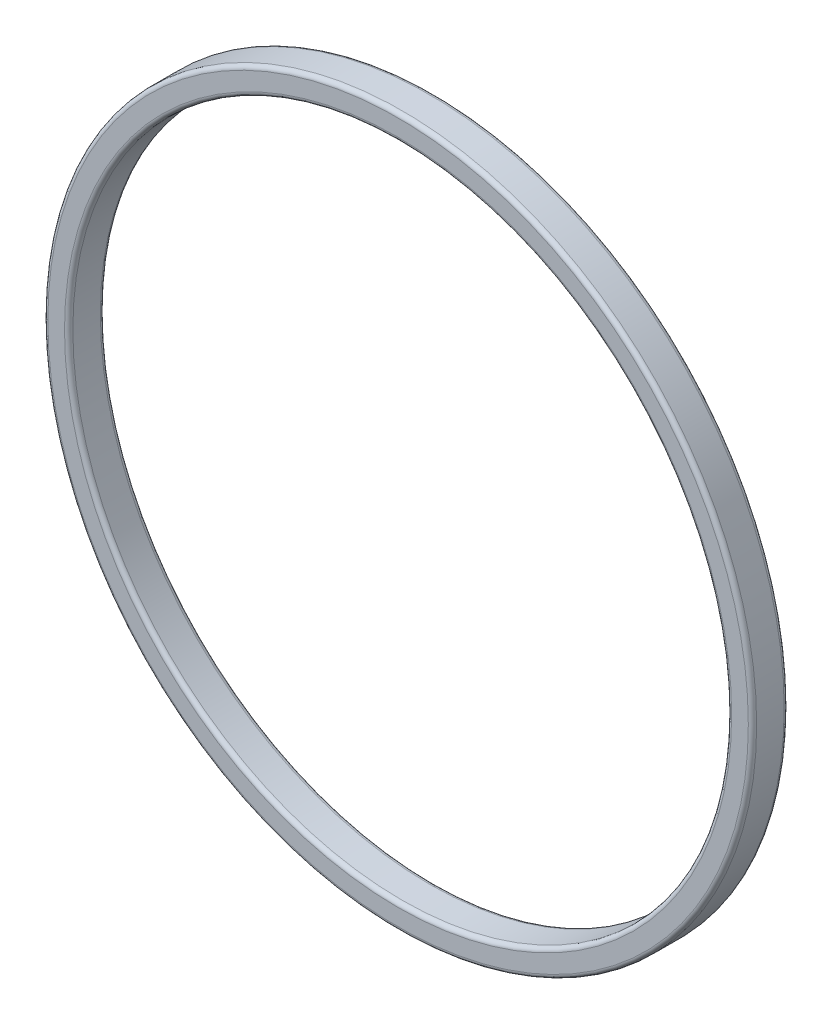
ISO-10303-21;
HEADER;
FILE_DESCRIPTION(('STEP AP214'),'2;1');
FILE_NAME('part.step','',(''),(''),'','','');
FILE_SCHEMA(('AUTOMOTIVE_DESIGN { 1 0 10303 214 1 1 1 1 }'));
ENDSEC;
DATA;
#1=APPLICATION_CONTEXT('core data for automotive mechanical design processes');
#2=APPLICATION_PROTOCOL_DEFINITION('international standard','automotive_design',2000,#1);
#3=PRODUCT_CONTEXT('',#1,'mechanical');
#4=PRODUCT('Part','Part','',(#3));
#5=PRODUCT_RELATED_PRODUCT_CATEGORY('part','',(#4));
#6=PRODUCT_DEFINITION_FORMATION('','',#4);
#7=PRODUCT_DEFINITION_CONTEXT('part definition',#1,'design');
#8=PRODUCT_DEFINITION('design','',#6,#7);
#9=PRODUCT_DEFINITION_SHAPE('','',#8);
#10=(LENGTH_UNIT() NAMED_UNIT(*) SI_UNIT(.MILLI.,.METRE.));
#11=(NAMED_UNIT(*) PLANE_ANGLE_UNIT() SI_UNIT($,.RADIAN.));
#12=(NAMED_UNIT(*) SI_UNIT($,.STERADIAN.) SOLID_ANGLE_UNIT());
#13=UNCERTAINTY_MEASURE_WITH_UNIT(LENGTH_MEASURE(1.E-05),#10,'distance_accuracy_value','');
#14=(GEOMETRIC_REPRESENTATION_CONTEXT(3) GLOBAL_UNCERTAINTY_ASSIGNED_CONTEXT((#13)) GLOBAL_UNIT_ASSIGNED_CONTEXT((#10,
#11,#12)) REPRESENTATION_CONTEXT('',''));
#15=CARTESIAN_POINT('',(0.,0.,0.));
#16=DIRECTION('',(0.,0.,1.));
#17=DIRECTION('',(1.,0.,0.));
#18=AXIS2_PLACEMENT_3D('',#15,#16,#17);
#19=CARTESIAN_POINT('',(0.,0.,4.3));
#20=DIRECTION('',(0.,0.,1.));
#21=DIRECTION('',(1.,0.,0.));
#22=AXIS2_PLACEMENT_3D('',#19,#20,#21);
#23=PLANE('',#22);
#24=CARTESIAN_POINT('',(0.,0.,4.3));
#25=DIRECTION('',(0.,0.,1.));
#26=DIRECTION('',(1.,0.,0.));
#27=AXIS2_PLACEMENT_3D('',#24,#25,#26);
#28=CIRCLE('',#27,40.);
#29=CARTESIAN_POINT('',(40.,0.,4.3));
#30=VERTEX_POINT('',#29);
#31=EDGE_CURVE('E10',#30,#30,#28,.F.);
#32=ORIENTED_EDGE('',*,*,#31,.T.);
#33=EDGE_LOOP('',(#32));
#34=FACE_BOUND('',#33,.T.);
#35=CARTESIAN_POINT('',(0.,0.,4.3));
#36=DIRECTION('',(0.,0.,1.));
#37=DIRECTION('',(1.,0.,0.));
#38=AXIS2_PLACEMENT_3D('',#35,#36,#37);
#39=CIRCLE('',#38,42.);
#40=CARTESIAN_POINT('',(42.,0.,4.3));
#41=VERTEX_POINT('',#40);
#42=EDGE_CURVE('E42',#41,#41,#39,.T.);
#43=ORIENTED_EDGE('',*,*,#42,.T.);
#44=EDGE_LOOP('',(#43));
#45=FACE_BOUND('',#44,.T.);
#46=ADVANCED_FACE('F35',(#34,#45),#23,.T.);
#47=CARTESIAN_POINT('',(0.,0.,0.));
#48=DIRECTION('',(0.,0.,1.));
#49=DIRECTION('',(1.,0.,0.));
#50=AXIS2_PLACEMENT_3D('',#47,#48,#49);
#51=PLANE('',#50);
#52=CARTESIAN_POINT('',(0.,0.,0.));
#53=DIRECTION('',(0.,0.,1.));
#54=DIRECTION('',(1.,0.,0.));
#55=AXIS2_PLACEMENT_3D('',#52,#53,#54);
#56=CIRCLE('',#55,40.);
#57=CARTESIAN_POINT('',(40.,0.,0.));
#58=VERTEX_POINT('',#57);
#59=EDGE_CURVE('E61',#58,#58,#56,.T.);
#60=ORIENTED_EDGE('',*,*,#59,.T.);
#61=EDGE_LOOP('',(#60));
#62=FACE_BOUND('',#61,.T.);
#63=CARTESIAN_POINT('',(0.,0.,0.));
#64=DIRECTION('',(0.,0.,1.));
#65=DIRECTION('',(1.,0.,0.));
#66=AXIS2_PLACEMENT_3D('',#63,#64,#65);
#67=CIRCLE('',#66,42.);
#68=CARTESIAN_POINT('',(42.,0.,0.));
#69=VERTEX_POINT('',#68);
#70=EDGE_CURVE('E64',#69,#69,#67,.F.);
#71=ORIENTED_EDGE('',*,*,#70,.T.);
#72=EDGE_LOOP('',(#71));
#73=FACE_BOUND('',#72,.T.);
#74=ADVANCED_FACE('F68',(#62,#73),#51,.F.);
#75=CARTESIAN_POINT('',(0.,0.,4.3));
#76=DIRECTION('',(0.,0.,-1.));
#77=DIRECTION('',(-1.,0.,0.));
#78=AXIS2_PLACEMENT_3D('',#75,#76,#77);
#79=CYLINDRICAL_SURFACE('',#78,42.5);
#80=CARTESIAN_POINT('',(0.,0.,0.5));
#81=DIRECTION('',(0.,0.,1.));
#82=DIRECTION('',(1.,0.,0.));
#83=AXIS2_PLACEMENT_3D('',#80,#81,#82);
#84=CIRCLE('',#83,42.5);
#85=CARTESIAN_POINT('',(-42.5,0.,0.5));
#86=VERTEX_POINT('',#85);
#87=EDGE_CURVE('E46',#86,#86,#84,.T.);
#88=CARTESIAN_POINT('',(0.,0.,3.8));
#89=DIRECTION('',(0.,0.,1.));
#90=DIRECTION('',(1.,0.,0.));
#91=AXIS2_PLACEMENT_3D('',#88,#89,#90);
#92=CIRCLE('',#91,42.5);
#93=CARTESIAN_POINT('',(-42.5,0.,3.8));
#94=VERTEX_POINT('',#93);
#95=EDGE_CURVE('E50',#94,#94,#92,.F.);
#96=CARTESIAN_POINT('',(-42.5,0.,0.5));
#97=CARTESIAN_POINT('',(-42.5,0.,0.534375));
#98=CARTESIAN_POINT('',(-42.5,0.,0.56875));
#99=CARTESIAN_POINT('',(-42.5,0.,0.6375));
#100=CARTESIAN_POINT('',(-42.5,0.,0.671875));
#101=CARTESIAN_POINT('',(-42.5,0.,0.740625));
#102=CARTESIAN_POINT('',(-42.5,0.,0.775));
#103=CARTESIAN_POINT('',(-42.5,0.,0.84375));
#104=CARTESIAN_POINT('',(-42.5,0.,0.878125));
#105=CARTESIAN_POINT('',(-42.5,0.,0.946875));
#106=CARTESIAN_POINT('',(-42.5,0.,0.98125));
#107=CARTESIAN_POINT('',(-42.5,0.,1.05));
#108=CARTESIAN_POINT('',(-42.5,0.,1.084375));
#109=CARTESIAN_POINT('',(-42.5,0.,1.153125));
#110=CARTESIAN_POINT('',(-42.5,0.,1.1875));
#111=CARTESIAN_POINT('',(-42.5,0.,1.25625));
#112=CARTESIAN_POINT('',(-42.5,0.,1.290625));
#113=CARTESIAN_POINT('',(-42.5,0.,1.359375));
#114=CARTESIAN_POINT('',(-42.5,0.,1.39375));
#115=CARTESIAN_POINT('',(-42.5,0.,1.4625));
#116=CARTESIAN_POINT('',(-42.5,0.,1.496875));
#117=CARTESIAN_POINT('',(-42.5,0.,1.565625));
#118=CARTESIAN_POINT('',(-42.5,0.,1.6));
#119=CARTESIAN_POINT('',(-42.5,0.,1.66875));
#120=CARTESIAN_POINT('',(-42.5,0.,1.703125));
#121=CARTESIAN_POINT('',(-42.5,0.,1.771875));
#122=CARTESIAN_POINT('',(-42.5,0.,1.80625));
#123=CARTESIAN_POINT('',(-42.5,0.,1.875));
#124=CARTESIAN_POINT('',(-42.5,0.,1.909375));
#125=CARTESIAN_POINT('',(-42.5,0.,1.978125));
#126=CARTESIAN_POINT('',(-42.5,0.,2.0125));
#127=CARTESIAN_POINT('',(-42.5,0.,2.08125));
#128=CARTESIAN_POINT('',(-42.5,0.,2.115625));
#129=CARTESIAN_POINT('',(-42.5,0.,2.184375));
#130=CARTESIAN_POINT('',(-42.5,0.,2.21875));
#131=CARTESIAN_POINT('',(-42.5,0.,2.2875));
#132=CARTESIAN_POINT('',(-42.5,0.,2.321875));
#133=CARTESIAN_POINT('',(-42.5,0.,2.390625));
#134=CARTESIAN_POINT('',(-42.5,0.,2.425));
#135=CARTESIAN_POINT('',(-42.5,0.,2.49375));
#136=CARTESIAN_POINT('',(-42.5,0.,2.528125));
#137=CARTESIAN_POINT('',(-42.5,0.,2.596875));
#138=CARTESIAN_POINT('',(-42.5,0.,2.63125));
#139=CARTESIAN_POINT('',(-42.5,0.,2.7));
#140=CARTESIAN_POINT('',(-42.5,0.,2.734375));
#141=CARTESIAN_POINT('',(-42.5,0.,2.803125));
#142=CARTESIAN_POINT('',(-42.5,0.,2.8375));
#143=CARTESIAN_POINT('',(-42.5,0.,2.90625));
#144=CARTESIAN_POINT('',(-42.5,0.,2.940625));
#145=CARTESIAN_POINT('',(-42.5,0.,3.009375));
#146=CARTESIAN_POINT('',(-42.5,0.,3.04375));
#147=CARTESIAN_POINT('',(-42.5,0.,3.1125));
#148=CARTESIAN_POINT('',(-42.5,0.,3.146875));
#149=CARTESIAN_POINT('',(-42.5,0.,3.215625));
#150=CARTESIAN_POINT('',(-42.5,0.,3.25));
#151=CARTESIAN_POINT('',(-42.5,0.,3.31875));
#152=CARTESIAN_POINT('',(-42.5,0.,3.353125));
#153=CARTESIAN_POINT('',(-42.5,0.,3.421875));
#154=CARTESIAN_POINT('',(-42.5,0.,3.45625));
#155=CARTESIAN_POINT('',(-42.5,0.,3.525));
#156=CARTESIAN_POINT('',(-42.5,0.,3.559375));
#157=CARTESIAN_POINT('',(-42.5,0.,3.628125));
#158=CARTESIAN_POINT('',(-42.5,0.,3.6625));
#159=CARTESIAN_POINT('',(-42.5,0.,3.73125));
#160=CARTESIAN_POINT('',(-42.5,0.,3.765625));
#161=CARTESIAN_POINT('',(-42.5,0.,3.8));
#162=B_SPLINE_CURVE_WITH_KNOTS('',3,(#96,#97,#98,#99,#100,#101,#102,#103,#104,#105,#106,#107,
#108,#109,#110,#111,#112,#113,#114,#115,#116,#117,#118,#119,#120,#121,#122,#123,#124,#125,#126,
#127,#128,#129,#130,#131,#132,#133,#134,#135,#136,#137,#138,#139,#140,#141,#142,#143,#144,#145,
#146,#147,#148,#149,#150,#151,#152,#153,#154,#155,#156,#157,#158,#159,#160,#161),.UNSPECIFIED.,
.F.,.F.,(4,2,2,2,2,2,2,2,2,2,2,2,2,2,2,2,2,2,2,2,2,2,2,2,2,2,2,2,2,2,2,2,4),(0.,0.103125,
0.20625,0.309375,0.4125,0.515625,0.61875,0.721875,0.825,0.928125,1.03125,1.134375,1.2375,
1.340625,1.44375,1.546875,1.65,1.753125,1.85625,1.959375,2.0625,2.165625,2.26875,2.371875,2.475,
2.578125,2.68125,2.784375,2.8875,2.990625,3.09375,3.196875,3.3),.UNSPECIFIED.);
#163=EDGE_CURVE('BSEAM78',#86,#94,#162,.T.);
#164=ORIENTED_EDGE('',*,*,#87,.T.);
#165=ORIENTED_EDGE('',*,*,#95,.T.);
#166=ORIENTED_EDGE('',*,*,#163,.T.);
#167=ORIENTED_EDGE('',*,*,#163,.F.);
#168=EDGE_LOOP('',(#164,#166,#165,#167));
#169=FACE_BOUND('',#168,.T.);
#170=ADVANCED_FACE('F78',(#169),#79,.T.);
#171=CARTESIAN_POINT('',(0.,0.,4.3));
#172=DIRECTION('',(0.,0.,-1.));
#173=DIRECTION('',(-1.,0.,0.));
#174=AXIS2_PLACEMENT_3D('',#171,#172,#173);
#175=CYLINDRICAL_SURFACE('',#174,39.5);
#176=CARTESIAN_POINT('',(0.,0.,0.5));
#177=DIRECTION('',(0.,0.,1.));
#178=DIRECTION('',(1.,0.,0.));
#179=AXIS2_PLACEMENT_3D('',#176,#177,#178);
#180=CIRCLE('',#179,39.5);
#181=CARTESIAN_POINT('',(-39.5,0.,0.5));
#182=VERTEX_POINT('',#181);
#183=EDGE_CURVE('E55',#182,#182,#180,.F.);
#184=CARTESIAN_POINT('',(0.,0.,3.8));
#185=DIRECTION('',(0.,0.,1.));
#186=DIRECTION('',(1.,0.,0.));
#187=AXIS2_PLACEMENT_3D('',#184,#185,#186);
#188=CIRCLE('',#187,39.5);
#189=CARTESIAN_POINT('',(-39.5,0.,3.8));
#190=VERTEX_POINT('',#189);
#191=EDGE_CURVE('E58',#190,#190,#188,.T.);
#192=CARTESIAN_POINT('',(-39.5,0.,0.5));
#193=CARTESIAN_POINT('',(-39.5,0.,0.534375));
#194=CARTESIAN_POINT('',(-39.5,0.,0.56875));
#195=CARTESIAN_POINT('',(-39.5,0.,0.6375));
#196=CARTESIAN_POINT('',(-39.5,0.,0.671875));
#197=CARTESIAN_POINT('',(-39.5,0.,0.740625));
#198=CARTESIAN_POINT('',(-39.5,0.,0.775));
#199=CARTESIAN_POINT('',(-39.5,0.,0.84375));
#200=CARTESIAN_POINT('',(-39.5,0.,0.878125));
#201=CARTESIAN_POINT('',(-39.5,0.,0.946875));
#202=CARTESIAN_POINT('',(-39.5,0.,0.98125));
#203=CARTESIAN_POINT('',(-39.5,0.,1.05));
#204=CARTESIAN_POINT('',(-39.5,0.,1.084375));
#205=CARTESIAN_POINT('',(-39.5,0.,1.153125));
#206=CARTESIAN_POINT('',(-39.5,0.,1.1875));
#207=CARTESIAN_POINT('',(-39.5,0.,1.25625));
#208=CARTESIAN_POINT('',(-39.5,0.,1.290625));
#209=CARTESIAN_POINT('',(-39.5,0.,1.359375));
#210=CARTESIAN_POINT('',(-39.5,0.,1.39375));
#211=CARTESIAN_POINT('',(-39.5,0.,1.4625));
#212=CARTESIAN_POINT('',(-39.5,0.,1.496875));
#213=CARTESIAN_POINT('',(-39.5,0.,1.565625));
#214=CARTESIAN_POINT('',(-39.5,0.,1.6));
#215=CARTESIAN_POINT('',(-39.5,0.,1.66875));
#216=CARTESIAN_POINT('',(-39.5,0.,1.703125));
#217=CARTESIAN_POINT('',(-39.5,0.,1.771875));
#218=CARTESIAN_POINT('',(-39.5,0.,1.80625));
#219=CARTESIAN_POINT('',(-39.5,0.,1.875));
#220=CARTESIAN_POINT('',(-39.5,0.,1.909375));
#221=CARTESIAN_POINT('',(-39.5,0.,1.978125));
#222=CARTESIAN_POINT('',(-39.5,0.,2.0125));
#223=CARTESIAN_POINT('',(-39.5,0.,2.08125));
#224=CARTESIAN_POINT('',(-39.5,0.,2.115625));
#225=CARTESIAN_POINT('',(-39.5,0.,2.184375));
#226=CARTESIAN_POINT('',(-39.5,0.,2.21875));
#227=CARTESIAN_POINT('',(-39.5,0.,2.2875));
#228=CARTESIAN_POINT('',(-39.5,0.,2.321875));
#229=CARTESIAN_POINT('',(-39.5,0.,2.390625));
#230=CARTESIAN_POINT('',(-39.5,0.,2.425));
#231=CARTESIAN_POINT('',(-39.5,0.,2.49375));
#232=CARTESIAN_POINT('',(-39.5,0.,2.528125));
#233=CARTESIAN_POINT('',(-39.5,0.,2.596875));
#234=CARTESIAN_POINT('',(-39.5,0.,2.63125));
#235=CARTESIAN_POINT('',(-39.5,0.,2.7));
#236=CARTESIAN_POINT('',(-39.5,0.,2.734375));
#237=CARTESIAN_POINT('',(-39.5,0.,2.803125));
#238=CARTESIAN_POINT('',(-39.5,0.,2.8375));
#239=CARTESIAN_POINT('',(-39.5,0.,2.90625));
#240=CARTESIAN_POINT('',(-39.5,0.,2.940625));
#241=CARTESIAN_POINT('',(-39.5,0.,3.009375));
#242=CARTESIAN_POINT('',(-39.5,0.,3.04375));
#243=CARTESIAN_POINT('',(-39.5,0.,3.1125));
#244=CARTESIAN_POINT('',(-39.5,0.,3.146875));
#245=CARTESIAN_POINT('',(-39.5,0.,3.215625));
#246=CARTESIAN_POINT('',(-39.5,0.,3.25));
#247=CARTESIAN_POINT('',(-39.5,0.,3.31875));
#248=CARTESIAN_POINT('',(-39.5,0.,3.353125));
#249=CARTESIAN_POINT('',(-39.5,0.,3.421875));
#250=CARTESIAN_POINT('',(-39.5,0.,3.45625));
#251=CARTESIAN_POINT('',(-39.5,0.,3.525));
#252=CARTESIAN_POINT('',(-39.5,0.,3.559375));
#253=CARTESIAN_POINT('',(-39.5,0.,3.628125));
#254=CARTESIAN_POINT('',(-39.5,0.,3.6625));
#255=CARTESIAN_POINT('',(-39.5,0.,3.73125));
#256=CARTESIAN_POINT('',(-39.5,0.,3.765625));
#257=CARTESIAN_POINT('',(-39.5,0.,3.8));
#258=B_SPLINE_CURVE_WITH_KNOTS('',3,(#192,#193,#194,#195,#196,#197,#198,#199,#200,#201,#202,
#203,#204,#205,#206,#207,#208,#209,#210,#211,#212,#213,#214,#215,#216,#217,#218,#219,#220,#221,
#222,#223,#224,#225,#226,#227,#228,#229,#230,#231,#232,#233,#234,#235,#236,#237,#238,#239,#240,
#241,#242,#243,#244,#245,#246,#247,#248,#249,#250,#251,#252,#253,#254,#255,#256,#257),
.UNSPECIFIED.,.F.,.F.,(4,2,2,2,2,2,2,2,2,2,2,2,2,2,2,2,2,2,2,2,2,2,2,2,2,2,2,2,2,2,2,2,4),(0.,
0.103125,0.20625,0.309375,0.4125,0.515625,0.61875,0.721875,0.825,0.928125,1.03125,1.134375,
1.2375,1.340625,1.44375,1.546875,1.65,1.753125,1.85625,1.959375,2.0625,2.165625,2.26875,
2.371875,2.475,2.578125,2.68125,2.784375,2.8875,2.990625,3.09375,3.196875,3.3),.UNSPECIFIED.);
#259=EDGE_CURVE('BSEAM81',#182,#190,#258,.T.);
#260=ORIENTED_EDGE('',*,*,#183,.T.);
#261=ORIENTED_EDGE('',*,*,#191,.T.);
#262=ORIENTED_EDGE('',*,*,#259,.T.);
#263=ORIENTED_EDGE('',*,*,#259,.F.);
#264=EDGE_LOOP('',(#260,#262,#261,#263));
#265=FACE_BOUND('',#264,.T.);
#266=ADVANCED_FACE('F81',(#265),#175,.F.);
#267=CARTESIAN_POINT('',(0.,0.,0.5));
#268=DIRECTION('',(0.,0.,1.));
#269=DIRECTION('',(1.,0.,0.));
#270=AXIS2_PLACEMENT_3D('',#267,#268,#269);
#271=TOROIDAL_SURFACE('',#270,40.,0.5);
#272=ORIENTED_EDGE('',*,*,#183,.F.);
#273=EDGE_LOOP('',(#272));
#274=FACE_BOUND('',#273,.T.);
#275=ORIENTED_EDGE('',*,*,#59,.F.);
#276=EDGE_LOOP('',(#275));
#277=FACE_BOUND('',#276,.T.);
#278=ADVANCED_FACE('F74',(#274,#277),#271,.T.);
#279=CARTESIAN_POINT('',(0.,0.,0.5));
#280=DIRECTION('',(0.,0.,1.));
#281=DIRECTION('',(1.,0.,0.));
#282=AXIS2_PLACEMENT_3D('',#279,#280,#281);
#283=TOROIDAL_SURFACE('',#282,42.,0.5);
#284=ORIENTED_EDGE('',*,*,#70,.F.);
#285=EDGE_LOOP('',(#284));
#286=FACE_BOUND('',#285,.T.);
#287=ORIENTED_EDGE('',*,*,#87,.F.);
#288=EDGE_LOOP('',(#287));
#289=FACE_BOUND('',#288,.T.);
#290=ADVANCED_FACE('F70',(#286,#289),#283,.T.);
#291=CARTESIAN_POINT('',(0.,0.,3.8));
#292=DIRECTION('',(0.,0.,1.));
#293=DIRECTION('',(1.,0.,0.));
#294=AXIS2_PLACEMENT_3D('',#291,#292,#293);
#295=TOROIDAL_SURFACE('',#294,40.,0.5);
#296=ORIENTED_EDGE('',*,*,#31,.F.);
#297=EDGE_LOOP('',(#296));
#298=FACE_BOUND('',#297,.T.);
#299=ORIENTED_EDGE('',*,*,#191,.F.);
#300=EDGE_LOOP('',(#299));
#301=FACE_BOUND('',#300,.T.);
#302=ADVANCED_FACE('F73',(#298,#301),#295,.T.);
#303=CARTESIAN_POINT('',(0.,0.,3.8));
#304=DIRECTION('',(0.,0.,1.));
#305=DIRECTION('',(1.,0.,0.));
#306=AXIS2_PLACEMENT_3D('',#303,#304,#305);
#307=TOROIDAL_SURFACE('',#306,42.,0.5);
#308=ORIENTED_EDGE('',*,*,#95,.F.);
#309=EDGE_LOOP('',(#308));
#310=FACE_BOUND('',#309,.T.);
#311=ORIENTED_EDGE('',*,*,#42,.F.);
#312=EDGE_LOOP('',(#311));
#313=FACE_BOUND('',#312,.T.);
#314=ADVANCED_FACE('F37',(#310,#313),#307,.T.);
#315=CLOSED_SHELL('',(#46,#74,#170,#266,#278,#290,#302,#314));
#316=MANIFOLD_SOLID_BREP('B2',#315);
#317=ADVANCED_BREP_SHAPE_REPRESENTATION('',(#18,#316),#14);
#318=SHAPE_DEFINITION_REPRESENTATION(#9,#317);
ENDSEC;
END-ISO-10303-21;
